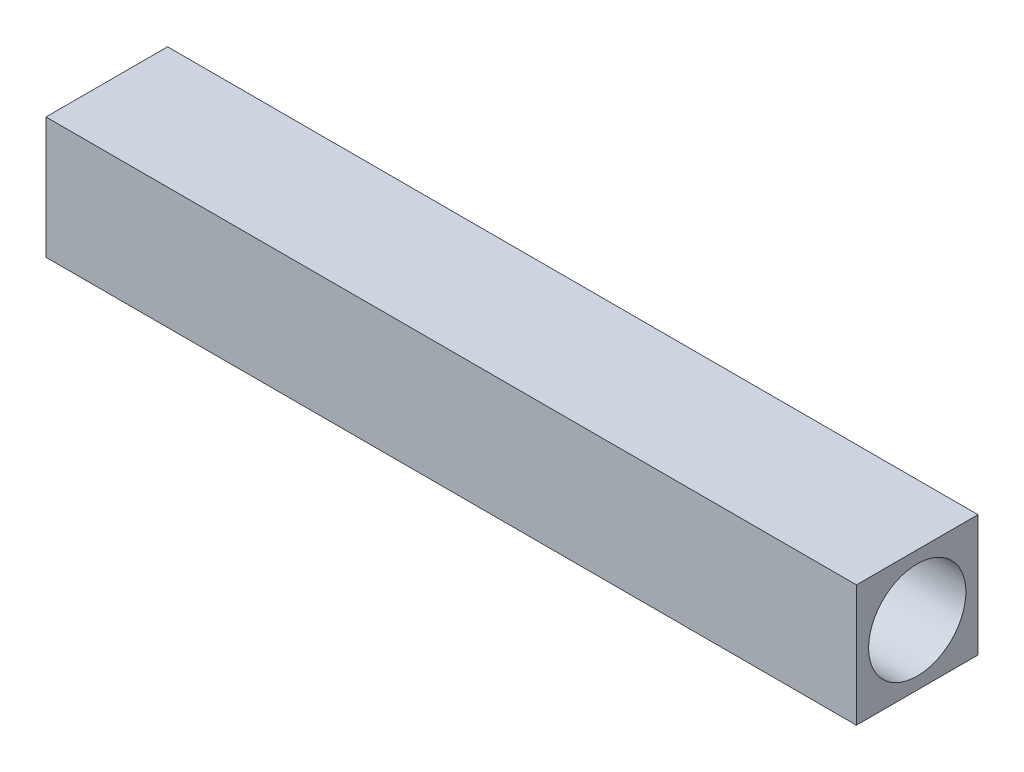
ISO-10303-21;
HEADER;
FILE_DESCRIPTION(('STEP AP214'),'2;1');
FILE_NAME('part.step','',(''),(''),'','','');
FILE_SCHEMA(('AUTOMOTIVE_DESIGN { 1 0 10303 214 1 1 1 1 }'));
ENDSEC;
DATA;
#1=APPLICATION_CONTEXT('core data for automotive mechanical design processes');
#2=APPLICATION_PROTOCOL_DEFINITION('international standard','automotive_design',2000,#1);
#3=PRODUCT_CONTEXT('',#1,'mechanical');
#4=PRODUCT('Part','Part','',(#3));
#5=PRODUCT_RELATED_PRODUCT_CATEGORY('part','',(#4));
#6=PRODUCT_DEFINITION_FORMATION('','',#4);
#7=PRODUCT_DEFINITION_CONTEXT('part definition',#1,'design');
#8=PRODUCT_DEFINITION('design','',#6,#7);
#9=PRODUCT_DEFINITION_SHAPE('','',#8);
#10=(LENGTH_UNIT() NAMED_UNIT(*) SI_UNIT(.MILLI.,.METRE.));
#11=(NAMED_UNIT(*) PLANE_ANGLE_UNIT() SI_UNIT($,.RADIAN.));
#12=(NAMED_UNIT(*) SI_UNIT($,.STERADIAN.) SOLID_ANGLE_UNIT());
#13=UNCERTAINTY_MEASURE_WITH_UNIT(LENGTH_MEASURE(1.E-05),#10,'distance_accuracy_value','');
#14=(GEOMETRIC_REPRESENTATION_CONTEXT(3) GLOBAL_UNCERTAINTY_ASSIGNED_CONTEXT((#13)) GLOBAL_UNIT_ASSIGNED_CONTEXT((#10,
#11,#12)) REPRESENTATION_CONTEXT('',''));
#15=CARTESIAN_POINT('',(0.,0.,0.));
#16=DIRECTION('',(0.,0.,1.));
#17=DIRECTION('',(1.,0.,0.));
#18=AXIS2_PLACEMENT_3D('',#15,#16,#17);
#19=CARTESIAN_POINT('',(317.5,0.,0.));
#20=DIRECTION('',(1.,0.,0.));
#21=DIRECTION('',(0.,0.,-1.));
#22=AXIS2_PLACEMENT_3D('',#19,#20,#21);
#23=PLANE('',#22);
#24=DIRECTION('',(0.,1.,0.));
#25=VECTOR('',#24,1.);
#26=CARTESIAN_POINT('',(317.5,0.,0.));
#27=LINE('',#26,#25);
#28=CARTESIAN_POINT('',(317.5,0.,0.));
#29=VERTEX_POINT('',#28);
#30=CARTESIAN_POINT('',(317.5,95.25,0.));
#31=VERTEX_POINT('',#30);
#32=EDGE_CURVE('E91',#29,#31,#27,.T.);
#33=ORIENTED_EDGE('',*,*,#32,.T.);
#34=DIRECTION('',(0.,0.,1.));
#35=VECTOR('',#34,1.);
#36=CARTESIAN_POINT('',(317.5,95.25,0.));
#37=LINE('',#36,#35);
#38=CARTESIAN_POINT('',(317.5,95.25,95.25));
#39=VERTEX_POINT('',#38);
#40=EDGE_CURVE('E86',#31,#39,#37,.T.);
#41=ORIENTED_EDGE('',*,*,#40,.T.);
#42=DIRECTION('',(0.,-1.,0.));
#43=VECTOR('',#42,1.);
#44=CARTESIAN_POINT('',(317.5,0.,95.25));
#45=LINE('',#44,#43);
#46=CARTESIAN_POINT('',(317.5,0.,95.25));
#47=VERTEX_POINT('',#46);
#48=EDGE_CURVE('E87',#39,#47,#45,.T.);
#49=ORIENTED_EDGE('',*,*,#48,.T.);
#50=DIRECTION('',(0.,0.,-1.));
#51=VECTOR('',#50,1.);
#52=CARTESIAN_POINT('',(317.5,0.,0.));
#53=LINE('',#52,#51);
#54=EDGE_CURVE('E57',#47,#29,#53,.T.);
#55=ORIENTED_EDGE('',*,*,#54,.T.);
#56=EDGE_LOOP('',(#33,#41,#49,#55));
#57=FACE_BOUND('',#56,.T.);
#58=CARTESIAN_POINT('',(317.5,47.625,47.625));
#59=DIRECTION('',(1.,0.,0.));
#60=DIRECTION('',(0.,0.,-1.));
#61=AXIS2_PLACEMENT_3D('',#58,#59,#60);
#62=CIRCLE('',#61,38.1);
#63=CARTESIAN_POINT('',(317.5,47.625,85.725));
#64=VERTEX_POINT('',#63);
#65=EDGE_CURVE('E106',#64,#64,#62,.T.);
#66=ORIENTED_EDGE('',*,*,#65,.F.);
#67=EDGE_LOOP('',(#66));
#68=FACE_BOUND('',#67,.T.);
#69=ADVANCED_FACE('F39',(#57,#68),#23,.T.);
#70=CARTESIAN_POINT('',(-317.5,0.,0.));
#71=DIRECTION('',(1.,0.,0.));
#72=DIRECTION('',(0.,0.,-1.));
#73=AXIS2_PLACEMENT_3D('',#70,#71,#72);
#74=PLANE('',#73);
#75=DIRECTION('',(0.,1.,0.));
#76=VECTOR('',#75,1.);
#77=CARTESIAN_POINT('',(-317.5,0.,0.));
#78=LINE('',#77,#76);
#79=CARTESIAN_POINT('',(-317.5,0.,0.));
#80=VERTEX_POINT('',#79);
#81=CARTESIAN_POINT('',(-317.5,95.25,0.));
#82=VERTEX_POINT('',#81);
#83=EDGE_CURVE('E104',#80,#82,#78,.T.);
#84=ORIENTED_EDGE('',*,*,#83,.F.);
#85=DIRECTION('',(0.,0.,-1.));
#86=VECTOR('',#85,1.);
#87=CARTESIAN_POINT('',(-317.5,0.,0.));
#88=LINE('',#87,#86);
#89=CARTESIAN_POINT('',(-317.5,0.,95.25));
#90=VERTEX_POINT('',#89);
#91=EDGE_CURVE('E80',#90,#80,#88,.T.);
#92=ORIENTED_EDGE('',*,*,#91,.F.);
#93=DIRECTION('',(0.,-1.,0.));
#94=VECTOR('',#93,1.);
#95=CARTESIAN_POINT('',(-317.5,0.,95.25));
#96=LINE('',#95,#94);
#97=CARTESIAN_POINT('',(-317.5,95.25,95.25));
#98=VERTEX_POINT('',#97);
#99=EDGE_CURVE('E74',#98,#90,#96,.T.);
#100=ORIENTED_EDGE('',*,*,#99,.F.);
#101=DIRECTION('',(0.,0.,1.));
#102=VECTOR('',#101,1.);
#103=CARTESIAN_POINT('',(-317.5,95.25,0.));
#104=LINE('',#103,#102);
#105=EDGE_CURVE('E94',#82,#98,#104,.T.);
#106=ORIENTED_EDGE('',*,*,#105,.F.);
#107=EDGE_LOOP('',(#84,#92,#100,#106));
#108=FACE_BOUND('',#107,.T.);
#109=CARTESIAN_POINT('',(-317.5,47.625,47.625));
#110=DIRECTION('',(1.,0.,0.));
#111=DIRECTION('',(0.,0.,-1.));
#112=AXIS2_PLACEMENT_3D('',#109,#110,#111);
#113=CIRCLE('',#112,38.1);
#114=CARTESIAN_POINT('',(-317.5,47.625,85.725));
#115=VERTEX_POINT('',#114);
#116=EDGE_CURVE('E119',#115,#115,#113,.T.);
#117=ORIENTED_EDGE('',*,*,#116,.T.);
#118=EDGE_LOOP('',(#117));
#119=FACE_BOUND('',#118,.T.);
#120=ADVANCED_FACE('F114',(#108,#119),#74,.F.);
#121=CARTESIAN_POINT('',(317.5,0.,0.));
#122=DIRECTION('',(0.,0.,1.));
#123=DIRECTION('',(1.,0.,0.));
#124=AXIS2_PLACEMENT_3D('',#121,#122,#123);
#125=PLANE('',#124);
#126=ORIENTED_EDGE('',*,*,#83,.T.);
#127=DIRECTION('',(-1.,0.,0.));
#128=VECTOR('',#127,1.);
#129=CARTESIAN_POINT('',(317.5,95.25,0.));
#130=LINE('',#129,#128);
#131=EDGE_CURVE('E11',#31,#82,#130,.T.);
#132=ORIENTED_EDGE('',*,*,#131,.F.);
#133=ORIENTED_EDGE('',*,*,#32,.F.);
#134=DIRECTION('',(-1.,0.,0.));
#135=VECTOR('',#134,1.);
#136=CARTESIAN_POINT('',(317.5,0.,0.));
#137=LINE('',#136,#135);
#138=EDGE_CURVE('E98',#29,#80,#137,.T.);
#139=ORIENTED_EDGE('',*,*,#138,.T.);
#140=EDGE_LOOP('',(#126,#132,#133,#139));
#141=FACE_BOUND('',#140,.T.);
#142=ADVANCED_FACE('F41',(#141),#125,.F.);
#143=CARTESIAN_POINT('',(317.5,95.25,0.));
#144=DIRECTION('',(0.,-1.,0.));
#145=DIRECTION('',(0.,0.,-1.));
#146=AXIS2_PLACEMENT_3D('',#143,#144,#145);
#147=PLANE('',#146);
#148=ORIENTED_EDGE('',*,*,#105,.T.);
#149=DIRECTION('',(-1.,0.,0.));
#150=VECTOR('',#149,1.);
#151=CARTESIAN_POINT('',(317.5,95.25,95.25));
#152=LINE('',#151,#150);
#153=EDGE_CURVE('E48',#39,#98,#152,.T.);
#154=ORIENTED_EDGE('',*,*,#153,.F.);
#155=ORIENTED_EDGE('',*,*,#40,.F.);
#156=ORIENTED_EDGE('',*,*,#131,.T.);
#157=EDGE_LOOP('',(#148,#154,#155,#156));
#158=FACE_BOUND('',#157,.T.);
#159=ADVANCED_FACE('F92',(#158),#147,.F.);
#160=CARTESIAN_POINT('',(317.5,0.,95.25));
#161=DIRECTION('',(0.,0.,-1.));
#162=DIRECTION('',(-1.,0.,0.));
#163=AXIS2_PLACEMENT_3D('',#160,#161,#162);
#164=PLANE('',#163);
#165=ORIENTED_EDGE('',*,*,#99,.T.);
#166=DIRECTION('',(-1.,0.,0.));
#167=VECTOR('',#166,1.);
#168=CARTESIAN_POINT('',(317.5,0.,95.25));
#169=LINE('',#168,#167);
#170=EDGE_CURVE('E96',#47,#90,#169,.T.);
#171=ORIENTED_EDGE('',*,*,#170,.F.);
#172=ORIENTED_EDGE('',*,*,#48,.F.);
#173=ORIENTED_EDGE('',*,*,#153,.T.);
#174=EDGE_LOOP('',(#165,#171,#172,#173));
#175=FACE_BOUND('',#174,.T.);
#176=ADVANCED_FACE('F100',(#175),#164,.F.);
#177=CARTESIAN_POINT('',(317.5,0.,0.));
#178=DIRECTION('',(0.,1.,0.));
#179=DIRECTION('',(0.,0.,1.));
#180=AXIS2_PLACEMENT_3D('',#177,#178,#179);
#181=PLANE('',#180);
#182=ORIENTED_EDGE('',*,*,#91,.T.);
#183=ORIENTED_EDGE('',*,*,#138,.F.);
#184=ORIENTED_EDGE('',*,*,#54,.F.);
#185=ORIENTED_EDGE('',*,*,#170,.T.);
#186=EDGE_LOOP('',(#182,#183,#184,#185));
#187=FACE_BOUND('',#186,.T.);
#188=ADVANCED_FACE('F112',(#187),#181,.F.);
#189=CARTESIAN_POINT('',(317.5,47.625,47.625));
#190=DIRECTION('',(-1.,0.,0.));
#191=DIRECTION('',(0.,0.,1.));
#192=AXIS2_PLACEMENT_3D('',#189,#190,#191);
#193=CYLINDRICAL_SURFACE('',#192,38.1);
#194=CARTESIAN_POINT('',(317.5,47.625,85.725));
#195=CARTESIAN_POINT('',(310.885416666667,47.625,85.725));
#196=CARTESIAN_POINT('',(304.270833333333,47.625,85.725));
#197=CARTESIAN_POINT('',(291.041666666667,47.625,85.725));
#198=CARTESIAN_POINT('',(284.427083333333,47.625,85.725));
#199=CARTESIAN_POINT('',(271.197916666667,47.625,85.725));
#200=CARTESIAN_POINT('',(264.583333333333,47.625,85.725));
#201=CARTESIAN_POINT('',(251.354166666667,47.625,85.725));
#202=CARTESIAN_POINT('',(244.739583333333,47.625,85.725));
#203=CARTESIAN_POINT('',(231.510416666667,47.625,85.725));
#204=CARTESIAN_POINT('',(224.895833333333,47.625,85.725));
#205=CARTESIAN_POINT('',(211.666666666667,47.625,85.725));
#206=CARTESIAN_POINT('',(205.052083333333,47.625,85.725));
#207=CARTESIAN_POINT('',(191.822916666667,47.625,85.725));
#208=CARTESIAN_POINT('',(185.208333333333,47.625,85.725));
#209=CARTESIAN_POINT('',(171.979166666667,47.625,85.725));
#210=CARTESIAN_POINT('',(165.364583333333,47.625,85.725));
#211=CARTESIAN_POINT('',(152.135416666667,47.625,85.725));
#212=CARTESIAN_POINT('',(145.520833333333,47.625,85.725));
#213=CARTESIAN_POINT('',(132.291666666667,47.625,85.725));
#214=CARTESIAN_POINT('',(125.677083333333,47.625,85.725));
#215=CARTESIAN_POINT('',(112.447916666667,47.625,85.725));
#216=CARTESIAN_POINT('',(105.833333333333,47.625,85.725));
#217=CARTESIAN_POINT('',(92.6041666666666,47.625,85.725));
#218=CARTESIAN_POINT('',(85.9895833333332,47.625,85.725));
#219=CARTESIAN_POINT('',(72.7604166666666,47.625,85.725));
#220=CARTESIAN_POINT('',(66.1458333333333,47.625,85.725));
#221=CARTESIAN_POINT('',(52.9166666666666,47.625,85.725));
#222=CARTESIAN_POINT('',(46.3020833333333,47.625,85.725));
#223=CARTESIAN_POINT('',(33.0729166666666,47.625,85.725));
#224=CARTESIAN_POINT('',(26.4583333333333,47.625,85.725));
#225=CARTESIAN_POINT('',(13.2291666666666,47.625,85.725));
#226=CARTESIAN_POINT('',(6.61458333333328,47.625,85.725));
#227=CARTESIAN_POINT('',(-6.61458333333339,47.625,85.725));
#228=CARTESIAN_POINT('',(-13.2291666666667,47.625,85.725));
#229=CARTESIAN_POINT('',(-26.4583333333334,47.625,85.725));
#230=CARTESIAN_POINT('',(-33.0729166666667,47.625,85.725));
#231=CARTESIAN_POINT('',(-46.3020833333334,47.625,85.725));
#232=CARTESIAN_POINT('',(-52.9166666666667,47.625,85.725));
#233=CARTESIAN_POINT('',(-66.1458333333334,47.625,85.725));
#234=CARTESIAN_POINT('',(-72.7604166666668,47.625,85.725));
#235=CARTESIAN_POINT('',(-85.9895833333334,47.625,85.725));
#236=CARTESIAN_POINT('',(-92.6041666666668,47.625,85.725));
#237=CARTESIAN_POINT('',(-105.833333333333,47.625,85.725));
#238=CARTESIAN_POINT('',(-112.447916666667,47.625,85.725));
#239=CARTESIAN_POINT('',(-125.677083333333,47.625,85.725));
#240=CARTESIAN_POINT('',(-132.291666666667,47.625,85.725));
#241=CARTESIAN_POINT('',(-145.520833333333,47.625,85.725));
#242=CARTESIAN_POINT('',(-152.135416666667,47.625,85.725));
#243=CARTESIAN_POINT('',(-165.364583333333,47.625,85.725));
#244=CARTESIAN_POINT('',(-171.979166666667,47.625,85.725));
#245=CARTESIAN_POINT('',(-185.208333333333,47.625,85.725));
#246=CARTESIAN_POINT('',(-191.822916666667,47.625,85.725));
#247=CARTESIAN_POINT('',(-205.052083333333,47.625,85.725));
#248=CARTESIAN_POINT('',(-211.666666666667,47.625,85.725));
#249=CARTESIAN_POINT('',(-224.895833333333,47.625,85.725));
#250=CARTESIAN_POINT('',(-231.510416666667,47.625,85.725));
#251=CARTESIAN_POINT('',(-244.739583333333,47.625,85.725));
#252=CARTESIAN_POINT('',(-251.354166666667,47.625,85.725));
#253=CARTESIAN_POINT('',(-264.583333333333,47.625,85.725));
#254=CARTESIAN_POINT('',(-271.197916666667,47.625,85.725));
#255=CARTESIAN_POINT('',(-284.427083333333,47.625,85.725));
#256=CARTESIAN_POINT('',(-291.041666666667,47.625,85.725));
#257=CARTESIAN_POINT('',(-304.270833333333,47.625,85.725));
#258=CARTESIAN_POINT('',(-310.885416666667,47.625,85.725));
#259=CARTESIAN_POINT('',(-317.5,47.625,85.725));
#260=B_SPLINE_CURVE_WITH_KNOTS('',3,(#194,#195,#196,#197,#198,#199,#200,#201,#202,#203,#204,
#205,#206,#207,#208,#209,#210,#211,#212,#213,#214,#215,#216,#217,#218,#219,#220,#221,#222,#223,
#224,#225,#226,#227,#228,#229,#230,#231,#232,#233,#234,#235,#236,#237,#238,#239,#240,#241,#242,
#243,#244,#245,#246,#247,#248,#249,#250,#251,#252,#253,#254,#255,#256,#257,#258,#259),
.UNSPECIFIED.,.F.,.F.,(4,2,2,2,2,2,2,2,2,2,2,2,2,2,2,2,2,2,2,2,2,2,2,2,2,2,2,2,2,2,2,2,4),(0.,
19.84375,39.6875,59.53125,79.375,99.2187500000001,119.0625,138.90625,158.75,178.59375,198.4375,
218.28125,238.125,257.96875,277.8125,297.65625,317.5,337.34375,357.1875,377.03125,396.875,
416.71875,436.5625,456.40625,476.25,496.09375,515.9375,535.78125,555.625,575.46875,595.3125,
615.15625,635.),.UNSPECIFIED.);
#261=EDGE_CURVE('BSEAM125',#64,#115,#260,.T.);
#262=ORIENTED_EDGE('',*,*,#65,.T.);
#263=ORIENTED_EDGE('',*,*,#116,.F.);
#264=ORIENTED_EDGE('',*,*,#261,.T.);
#265=ORIENTED_EDGE('',*,*,#261,.F.);
#266=EDGE_LOOP('',(#262,#264,#263,#265));
#267=FACE_BOUND('',#266,.T.);
#268=ADVANCED_FACE('F125',(#267),#193,.F.);
#269=CLOSED_SHELL('',(#69,#120,#142,#159,#176,#188,#268));
#270=MANIFOLD_SOLID_BREP('B2',#269);
#271=ADVANCED_BREP_SHAPE_REPRESENTATION('',(#18,#270),#14);
#272=SHAPE_DEFINITION_REPRESENTATION(#9,#271);
ENDSEC;
END-ISO-10303-21;
